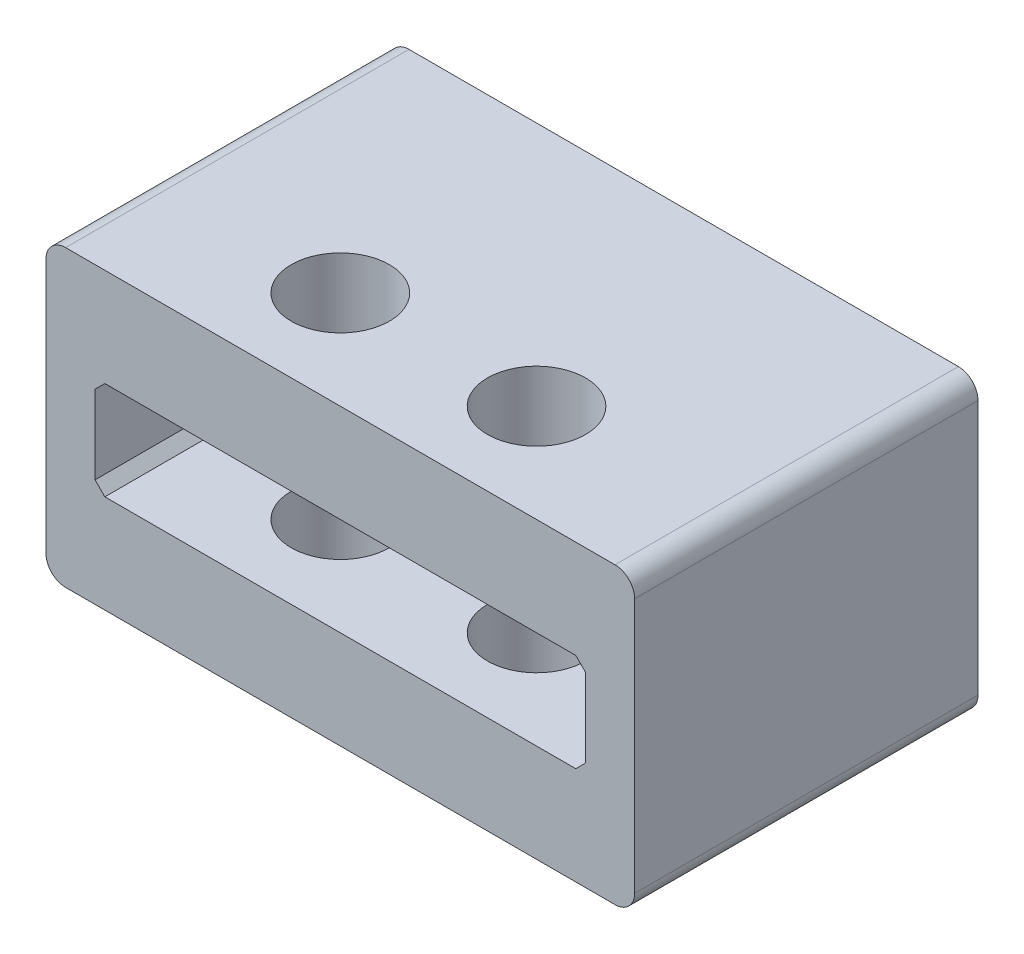
ISO-10303-21;
HEADER;
FILE_DESCRIPTION(('STEP AP214'),'2;1');
FILE_NAME('part.step','',(''),(''),'','','');
FILE_SCHEMA(('AUTOMOTIVE_DESIGN { 1 0 10303 214 1 1 1 1 }'));
ENDSEC;
DATA;
#1=APPLICATION_CONTEXT('core data for automotive mechanical design processes');
#2=APPLICATION_PROTOCOL_DEFINITION('international standard','automotive_design',2000,#1);
#3=PRODUCT_CONTEXT('',#1,'mechanical');
#4=PRODUCT('Part','Part','',(#3));
#5=PRODUCT_RELATED_PRODUCT_CATEGORY('part','',(#4));
#6=PRODUCT_DEFINITION_FORMATION('','',#4);
#7=PRODUCT_DEFINITION_CONTEXT('part definition',#1,'design');
#8=PRODUCT_DEFINITION('design','',#6,#7);
#9=PRODUCT_DEFINITION_SHAPE('','',#8);
#10=(LENGTH_UNIT() NAMED_UNIT(*) SI_UNIT(.MILLI.,.METRE.));
#11=(NAMED_UNIT(*) PLANE_ANGLE_UNIT() SI_UNIT($,.RADIAN.));
#12=(NAMED_UNIT(*) SI_UNIT($,.STERADIAN.) SOLID_ANGLE_UNIT());
#13=UNCERTAINTY_MEASURE_WITH_UNIT(LENGTH_MEASURE(1.E-05),#10,'distance_accuracy_value','');
#14=(GEOMETRIC_REPRESENTATION_CONTEXT(3) GLOBAL_UNCERTAINTY_ASSIGNED_CONTEXT((#13)) GLOBAL_UNIT_ASSIGNED_CONTEXT((#10,
#11,#12)) REPRESENTATION_CONTEXT('',''));
#15=CARTESIAN_POINT('',(0.,0.,0.));
#16=DIRECTION('',(0.,0.,1.));
#17=DIRECTION('',(1.,0.,0.));
#18=AXIS2_PLACEMENT_3D('',#15,#16,#17);
#19=CARTESIAN_POINT('',(0.,0.,45.));
#20=DIRECTION('',(0.,0.,1.));
#21=DIRECTION('',(1.,0.,0.));
#22=AXIS2_PLACEMENT_3D('',#19,#20,#21);
#23=PLANE('',#22);
#24=DIRECTION('',(0.,1.,0.));
#25=VECTOR('',#24,1.);
#26=CARTESIAN_POINT('',(-30.,15.,45.));
#27=LINE('',#26,#25);
#28=CARTESIAN_POINT('',(-30.,-13.,45.));
#29=VERTEX_POINT('',#28);
#30=CARTESIAN_POINT('',(-30.,13.,45.));
#31=VERTEX_POINT('',#30);
#32=EDGE_CURVE('E234',#29,#31,#27,.T.);
#33=ORIENTED_EDGE('',*,*,#32,.F.);
#34=CARTESIAN_POINT('',(-28.,-13.,45.));
#35=DIRECTION('',(0.,0.,1.));
#36=DIRECTION('',(1.,0.,0.));
#37=AXIS2_PLACEMENT_3D('',#34,#35,#36);
#38=CIRCLE('',#37,2.);
#39=CARTESIAN_POINT('',(-28.,-15.,45.));
#40=VERTEX_POINT('',#39);
#41=EDGE_CURVE('E313',#29,#40,#38,.T.);
#42=ORIENTED_EDGE('',*,*,#41,.T.);
#43=DIRECTION('',(-1.,0.,0.));
#44=VECTOR('',#43,1.);
#45=CARTESIAN_POINT('',(-30.,-15.,45.));
#46=LINE('',#45,#44);
#47=CARTESIAN_POINT('',(28.,-15.,45.));
#48=VERTEX_POINT('',#47);
#49=EDGE_CURVE('E225',#48,#40,#46,.T.);
#50=ORIENTED_EDGE('',*,*,#49,.F.);
#51=CARTESIAN_POINT('',(28.,-13.,45.));
#52=DIRECTION('',(0.,0.,1.));
#53=DIRECTION('',(1.,0.,0.));
#54=AXIS2_PLACEMENT_3D('',#51,#52,#53);
#55=CIRCLE('',#54,2.);
#56=CARTESIAN_POINT('',(30.,-13.,45.));
#57=VERTEX_POINT('',#56);
#58=EDGE_CURVE('E304',#48,#57,#55,.T.);
#59=ORIENTED_EDGE('',*,*,#58,.T.);
#60=DIRECTION('',(0.,-1.,0.));
#61=VECTOR('',#60,1.);
#62=CARTESIAN_POINT('',(30.,-15.,45.));
#63=LINE('',#62,#61);
#64=CARTESIAN_POINT('',(30.,13.,45.));
#65=VERTEX_POINT('',#64);
#66=EDGE_CURVE('E248',#65,#57,#63,.T.);
#67=ORIENTED_EDGE('',*,*,#66,.F.);
#68=CARTESIAN_POINT('',(28.,13.,45.));
#69=DIRECTION('',(0.,0.,1.));
#70=DIRECTION('',(1.,0.,0.));
#71=AXIS2_PLACEMENT_3D('',#68,#69,#70);
#72=CIRCLE('',#71,2.);
#73=CARTESIAN_POINT('',(28.,15.,45.));
#74=VERTEX_POINT('',#73);
#75=EDGE_CURVE('E307',#65,#74,#72,.T.);
#76=ORIENTED_EDGE('',*,*,#75,.T.);
#77=DIRECTION('',(1.,0.,0.));
#78=VECTOR('',#77,1.);
#79=CARTESIAN_POINT('',(30.,15.,45.));
#80=LINE('',#79,#78);
#81=CARTESIAN_POINT('',(-28.,15.,45.));
#82=VERTEX_POINT('',#81);
#83=EDGE_CURVE('E242',#82,#74,#80,.T.);
#84=ORIENTED_EDGE('',*,*,#83,.F.);
#85=CARTESIAN_POINT('',(-28.,13.,45.));
#86=DIRECTION('',(0.,0.,1.));
#87=DIRECTION('',(1.,0.,0.));
#88=AXIS2_PLACEMENT_3D('',#85,#86,#87);
#89=CIRCLE('',#88,2.);
#90=EDGE_CURVE('E310',#82,#31,#89,.T.);
#91=ORIENTED_EDGE('',*,*,#90,.T.);
#92=EDGE_LOOP('',(#33,#42,#50,#59,#67,#76,#84,#91));
#93=FACE_BOUND('',#92,.T.);
#94=DIRECTION('',(0.,-1.,0.));
#95=VECTOR('',#94,1.);
#96=CARTESIAN_POINT('',(25.,0.,45.));
#97=LINE('',#96,#95);
#98=CARTESIAN_POINT('',(25.,4.,45.));
#99=VERTEX_POINT('',#98);
#100=CARTESIAN_POINT('',(25.,-4.00000000000002,45.));
#101=VERTEX_POINT('',#100);
#102=EDGE_CURVE('E406',#99,#101,#97,.T.);
#103=ORIENTED_EDGE('',*,*,#102,.T.);
#104=DIRECTION('',(0.70710678118655,0.707106781186545,0.));
#105=VECTOR('',#104,1.);
#106=CARTESIAN_POINT('',(24.,-5.,45.));
#107=LINE('',#106,#105);
#108=CARTESIAN_POINT('',(24.,-5.,45.));
#109=VERTEX_POINT('',#108);
#110=EDGE_CURVE('E294',#101,#109,#107,.F.);
#111=ORIENTED_EDGE('',*,*,#110,.T.);
#112=DIRECTION('',(-1.,0.,0.));
#113=VECTOR('',#112,1.);
#114=CARTESIAN_POINT('',(0.,-5.,45.));
#115=LINE('',#114,#113);
#116=CARTESIAN_POINT('',(-24.,-5.,45.));
#117=VERTEX_POINT('',#116);
#118=EDGE_CURVE('E387',#109,#117,#115,.T.);
#119=ORIENTED_EDGE('',*,*,#118,.T.);
#120=DIRECTION('',(0.707106781186543,-0.707106781186552,0.));
#121=VECTOR('',#120,1.);
#122=CARTESIAN_POINT('',(-25.,-3.99999999999999,45.));
#123=LINE('',#122,#121);
#124=CARTESIAN_POINT('',(-25.,-3.99999999999999,45.));
#125=VERTEX_POINT('',#124);
#126=EDGE_CURVE('E288',#117,#125,#123,.F.);
#127=ORIENTED_EDGE('',*,*,#126,.T.);
#128=DIRECTION('',(0.,1.,0.));
#129=VECTOR('',#128,1.);
#130=CARTESIAN_POINT('',(-25.,0.,45.));
#131=LINE('',#130,#129);
#132=CARTESIAN_POINT('',(-25.,4.00000000000002,45.));
#133=VERTEX_POINT('',#132);
#134=EDGE_CURVE('E401',#125,#133,#131,.T.);
#135=ORIENTED_EDGE('',*,*,#134,.T.);
#136=DIRECTION('',(-0.70710678118655,-0.707106781186545,0.));
#137=VECTOR('',#136,1.);
#138=CARTESIAN_POINT('',(-24.,5.,45.));
#139=LINE('',#138,#137);
#140=CARTESIAN_POINT('',(-24.,5.,45.));
#141=VERTEX_POINT('',#140);
#142=EDGE_CURVE('E285',#133,#141,#139,.F.);
#143=ORIENTED_EDGE('',*,*,#142,.T.);
#144=DIRECTION('',(1.,0.,0.));
#145=VECTOR('',#144,1.);
#146=CARTESIAN_POINT('',(0.,5.,45.));
#147=LINE('',#146,#145);
#148=CARTESIAN_POINT('',(24.,5.,45.));
#149=VERTEX_POINT('',#148);
#150=EDGE_CURVE('E422',#141,#149,#147,.T.);
#151=ORIENTED_EDGE('',*,*,#150,.T.);
#152=DIRECTION('',(-0.707106781186543,0.707106781186552,0.));
#153=VECTOR('',#152,1.);
#154=CARTESIAN_POINT('',(25.,4.,45.));
#155=LINE('',#154,#153);
#156=EDGE_CURVE('E291',#149,#99,#155,.F.);
#157=ORIENTED_EDGE('',*,*,#156,.T.);
#158=EDGE_LOOP('',(#103,#111,#119,#127,#135,#143,#151,#157));
#159=FACE_BOUND('',#158,.T.);
#160=ADVANCED_FACE('F47',(#93,#159),#23,.T.);
#161=CARTESIAN_POINT('',(30.,0.,0.));
#162=DIRECTION('',(1.,0.,0.));
#163=DIRECTION('',(0.,1.,0.));
#164=AXIS2_PLACEMENT_3D('',#161,#162,#163);
#165=PLANE('',#164);
#166=DIRECTION('',(0.,1.,0.));
#167=VECTOR('',#166,1.);
#168=CARTESIAN_POINT('',(30.,0.,10.));
#169=LINE('',#168,#167);
#170=CARTESIAN_POINT('',(30.,-13.,10.));
#171=VERTEX_POINT('',#170);
#172=CARTESIAN_POINT('',(30.,13.,10.));
#173=VERTEX_POINT('',#172);
#174=EDGE_CURVE('E346',#171,#173,#169,.T.);
#175=ORIENTED_EDGE('',*,*,#174,.T.);
#176=DIRECTION('',(0.,0.,1.));
#177=VECTOR('',#176,1.);
#178=CARTESIAN_POINT('',(30.,13.,0.));
#179=LINE('',#178,#177);
#180=EDGE_CURVE('E11',#173,#65,#179,.T.);
#181=ORIENTED_EDGE('',*,*,#180,.T.);
#182=ORIENTED_EDGE('',*,*,#66,.T.);
#183=DIRECTION('',(0.,0.,1.));
#184=VECTOR('',#183,1.);
#185=CARTESIAN_POINT('',(30.,-13.,0.));
#186=LINE('',#185,#184);
#187=EDGE_CURVE('E56',#57,#171,#186,.F.);
#188=ORIENTED_EDGE('',*,*,#187,.T.);
#189=EDGE_LOOP('',(#175,#181,#182,#188));
#190=FACE_BOUND('',#189,.T.);
#191=ADVANCED_FACE('F345',(#190),#165,.T.);
#192=CARTESIAN_POINT('',(0.,0.,25.));
#193=DIRECTION('',(0.,0.,1.));
#194=DIRECTION('',(1.,0.,0.));
#195=AXIS2_PLACEMENT_3D('',#192,#193,#194);
#196=PLANE('',#195);
#197=DIRECTION('',(-1.,0.,0.));
#198=VECTOR('',#197,1.);
#199=CARTESIAN_POINT('',(25.,5.,25.));
#200=LINE('',#199,#198);
#201=CARTESIAN_POINT('',(24.,5.,25.));
#202=VERTEX_POINT('',#201);
#203=CARTESIAN_POINT('',(-24.,5.,25.));
#204=VERTEX_POINT('',#203);
#205=EDGE_CURVE('E391',#202,#204,#200,.T.);
#206=ORIENTED_EDGE('',*,*,#205,.T.);
#207=DIRECTION('',(0.70710678118655,0.707106781186545,0.));
#208=VECTOR('',#207,1.);
#209=CARTESIAN_POINT('',(-14.4999999999999,14.5,25.));
#210=LINE('',#209,#208);
#211=CARTESIAN_POINT('',(-25.,4.00000000000002,25.));
#212=VERTEX_POINT('',#211);
#213=EDGE_CURVE('E261',#204,#212,#210,.F.);
#214=ORIENTED_EDGE('',*,*,#213,.T.);
#215=DIRECTION('',(0.,-1.,0.));
#216=VECTOR('',#215,1.);
#217=CARTESIAN_POINT('',(-25.,5.,25.));
#218=LINE('',#217,#216);
#219=CARTESIAN_POINT('',(-25.,-3.99999999999999,25.));
#220=VERTEX_POINT('',#219);
#221=EDGE_CURVE('E405',#212,#220,#218,.T.);
#222=ORIENTED_EDGE('',*,*,#221,.T.);
#223=DIRECTION('',(-0.707106781186543,0.707106781186552,0.));
#224=VECTOR('',#223,1.);
#225=CARTESIAN_POINT('',(-14.5000000000002,-14.5,25.));
#226=LINE('',#225,#224);
#227=CARTESIAN_POINT('',(-24.,-5.,25.));
#228=VERTEX_POINT('',#227);
#229=EDGE_CURVE('E258',#220,#228,#226,.F.);
#230=ORIENTED_EDGE('',*,*,#229,.T.);
#231=DIRECTION('',(1.,0.,0.));
#232=VECTOR('',#231,1.);
#233=CARTESIAN_POINT('',(-25.,-5.,25.));
#234=LINE('',#233,#232);
#235=CARTESIAN_POINT('',(24.,-4.99999999999999,25.));
#236=VERTEX_POINT('',#235);
#237=EDGE_CURVE('E392',#228,#236,#234,.T.);
#238=ORIENTED_EDGE('',*,*,#237,.T.);
#239=DIRECTION('',(-0.70710678118655,-0.707106781186545,0.));
#240=VECTOR('',#239,1.);
#241=CARTESIAN_POINT('',(14.4999999999999,-14.5,25.));
#242=LINE('',#241,#240);
#243=CARTESIAN_POINT('',(25.,-4.00000000000002,25.));
#244=VERTEX_POINT('',#243);
#245=EDGE_CURVE('E252',#236,#244,#242,.F.);
#246=ORIENTED_EDGE('',*,*,#245,.T.);
#247=DIRECTION('',(0.,1.,0.));
#248=VECTOR('',#247,1.);
#249=CARTESIAN_POINT('',(25.,-5.,25.));
#250=LINE('',#249,#248);
#251=CARTESIAN_POINT('',(25.,4.,25.));
#252=VERTEX_POINT('',#251);
#253=EDGE_CURVE('E410',#244,#252,#250,.T.);
#254=ORIENTED_EDGE('',*,*,#253,.T.);
#255=DIRECTION('',(0.707106781186543,-0.707106781186552,0.));
#256=VECTOR('',#255,1.);
#257=CARTESIAN_POINT('',(14.5000000000002,14.5,25.));
#258=LINE('',#257,#256);
#259=EDGE_CURVE('E255',#252,#202,#258,.F.);
#260=ORIENTED_EDGE('',*,*,#259,.T.);
#261=EDGE_LOOP('',(#206,#214,#222,#230,#238,#246,#254,#260));
#262=FACE_BOUND('',#261,.T.);
#263=CARTESIAN_POINT('',(-15.,0.,25.));
#264=DIRECTION('',(0.,0.,-1.));
#265=DIRECTION('',(0.,1.,0.));
#266=AXIS2_PLACEMENT_3D('',#263,#264,#265);
#267=CIRCLE('',#266,4.);
#268=CARTESIAN_POINT('',(-15.,4.,25.));
#269=VERTEX_POINT('',#268);
#270=EDGE_CURVE('E396',#269,#269,#267,.T.);
#271=ORIENTED_EDGE('',*,*,#270,.T.);
#272=EDGE_LOOP('',(#271));
#273=FACE_BOUND('',#272,.T.);
#274=CARTESIAN_POINT('',(15.,0.,25.));
#275=DIRECTION('',(0.,0.,-1.));
#276=DIRECTION('',(0.,1.,0.));
#277=AXIS2_PLACEMENT_3D('',#274,#275,#276);
#278=CIRCLE('',#277,4.);
#279=CARTESIAN_POINT('',(15.,4.,25.));
#280=VERTEX_POINT('',#279);
#281=EDGE_CURVE('E395',#280,#280,#278,.T.);
#282=ORIENTED_EDGE('',*,*,#281,.T.);
#283=EDGE_LOOP('',(#282));
#284=FACE_BOUND('',#283,.T.);
#285=ADVANCED_FACE('F452',(#262,#273,#284),#196,.T.);
#286=CARTESIAN_POINT('',(-25.,0.,45.));
#287=DIRECTION('',(-1.,0.,0.));
#288=DIRECTION('',(0.,0.,1.));
#289=AXIS2_PLACEMENT_3D('',#286,#287,#288);
#290=PLANE('',#289);
#291=ORIENTED_EDGE('',*,*,#221,.F.);
#292=DIRECTION('',(0.,0.,1.));
#293=VECTOR('',#292,1.);
#294=CARTESIAN_POINT('',(-25.,4.00000000000002,45.));
#295=LINE('',#294,#293);
#296=EDGE_CURVE('E268',#212,#133,#295,.T.);
#297=ORIENTED_EDGE('',*,*,#296,.T.);
#298=ORIENTED_EDGE('',*,*,#134,.F.);
#299=DIRECTION('',(0.,0.,-1.));
#300=VECTOR('',#299,1.);
#301=CARTESIAN_POINT('',(-25.,-3.99999999999999,25.));
#302=LINE('',#301,#300);
#303=EDGE_CURVE('E264',#125,#220,#302,.T.);
#304=ORIENTED_EDGE('',*,*,#303,.T.);
#305=EDGE_LOOP('',(#291,#297,#298,#304));
#306=FACE_BOUND('',#305,.T.);
#307=ADVANCED_FACE('F468',(#306),#290,.F.);
#308=CARTESIAN_POINT('',(25.,0.,45.));
#309=DIRECTION('',(1.,0.,0.));
#310=DIRECTION('',(0.,1.,0.));
#311=AXIS2_PLACEMENT_3D('',#308,#309,#310);
#312=PLANE('',#311);
#313=ORIENTED_EDGE('',*,*,#102,.F.);
#314=DIRECTION('',(0.,0.,-1.));
#315=VECTOR('',#314,1.);
#316=CARTESIAN_POINT('',(25.,4.,25.));
#317=LINE('',#316,#315);
#318=EDGE_CURVE('E281',#99,#252,#317,.T.);
#319=ORIENTED_EDGE('',*,*,#318,.T.);
#320=ORIENTED_EDGE('',*,*,#253,.F.);
#321=DIRECTION('',(0.,0.,1.));
#322=VECTOR('',#321,1.);
#323=CARTESIAN_POINT('',(25.,-4.00000000000002,45.));
#324=LINE('',#323,#322);
#325=EDGE_CURVE('E278',#244,#101,#324,.T.);
#326=ORIENTED_EDGE('',*,*,#325,.T.);
#327=EDGE_LOOP('',(#313,#319,#320,#326));
#328=FACE_BOUND('',#327,.T.);
#329=ADVANCED_FACE('F485',(#328),#312,.F.);
#330=CARTESIAN_POINT('',(0.,5.,45.));
#331=DIRECTION('',(0.,1.,0.));
#332=DIRECTION('',(1.,0.,0.));
#333=AXIS2_PLACEMENT_3D('',#330,#331,#332);
#334=PLANE('',#333);
#335=CARTESIAN_POINT('',(10.,5.,35.));
#336=DIRECTION('',(0.,1.,0.));
#337=DIRECTION('',(1.,0.,0.));
#338=AXIS2_PLACEMENT_3D('',#335,#336,#337);
#339=CIRCLE('',#338,5.);
#340=CARTESIAN_POINT('',(5.,5.,35.));
#341=VERTEX_POINT('',#340);
#342=EDGE_CURVE('E415',#341,#341,#339,.T.);
#343=ORIENTED_EDGE('',*,*,#342,.T.);
#344=EDGE_LOOP('',(#343));
#345=FACE_BOUND('',#344,.T.);
#346=CARTESIAN_POINT('',(-10.,5.,35.));
#347=DIRECTION('',(0.,1.,0.));
#348=DIRECTION('',(1.,0.,0.));
#349=AXIS2_PLACEMENT_3D('',#346,#347,#348);
#350=CIRCLE('',#349,5.);
#351=CARTESIAN_POINT('',(-15.,5.,35.));
#352=VERTEX_POINT('',#351);
#353=EDGE_CURVE('E414',#352,#352,#350,.T.);
#354=ORIENTED_EDGE('',*,*,#353,.T.);
#355=EDGE_LOOP('',(#354));
#356=FACE_BOUND('',#355,.T.);
#357=ORIENTED_EDGE('',*,*,#150,.F.);
#358=DIRECTION('',(0.,0.,-1.));
#359=VECTOR('',#358,1.);
#360=CARTESIAN_POINT('',(-24.,5.,25.));
#361=LINE('',#360,#359);
#362=EDGE_CURVE('E247',#141,#204,#361,.T.);
#363=ORIENTED_EDGE('',*,*,#362,.T.);
#364=ORIENTED_EDGE('',*,*,#205,.F.);
#365=DIRECTION('',(0.,0.,1.));
#366=VECTOR('',#365,1.);
#367=CARTESIAN_POINT('',(24.,5.,45.));
#368=LINE('',#367,#366);
#369=EDGE_CURVE('E244',#202,#149,#368,.T.);
#370=ORIENTED_EDGE('',*,*,#369,.T.);
#371=EDGE_LOOP('',(#357,#363,#364,#370));
#372=FACE_BOUND('',#371,.T.);
#373=ADVANCED_FACE('F476',(#345,#356,#372),#334,.F.);
#374=CARTESIAN_POINT('',(0.,-5.,45.));
#375=DIRECTION('',(0.,-1.,0.));
#376=DIRECTION('',(0.,0.,-1.));
#377=AXIS2_PLACEMENT_3D('',#374,#375,#376);
#378=PLANE('',#377);
#379=CARTESIAN_POINT('',(10.,-5.,35.));
#380=DIRECTION('',(0.,-1.,0.));
#381=DIRECTION('',(1.,0.,0.));
#382=AXIS2_PLACEMENT_3D('',#379,#380,#381);
#383=CIRCLE('',#382,5.);
#384=CARTESIAN_POINT('',(5.,-5.,35.));
#385=VERTEX_POINT('',#384);
#386=EDGE_CURVE('E399',#385,#385,#383,.T.);
#387=ORIENTED_EDGE('',*,*,#386,.T.);
#388=EDGE_LOOP('',(#387));
#389=FACE_BOUND('',#388,.T.);
#390=CARTESIAN_POINT('',(-10.,-5.,35.));
#391=DIRECTION('',(0.,-1.,0.));
#392=DIRECTION('',(1.,0.,0.));
#393=AXIS2_PLACEMENT_3D('',#390,#391,#392);
#394=CIRCLE('',#393,5.);
#395=CARTESIAN_POINT('',(-15.,-5.,35.));
#396=VERTEX_POINT('',#395);
#397=EDGE_CURVE('E411',#396,#396,#394,.T.);
#398=ORIENTED_EDGE('',*,*,#397,.T.);
#399=EDGE_LOOP('',(#398));
#400=FACE_BOUND('',#399,.T.);
#401=ORIENTED_EDGE('',*,*,#237,.F.);
#402=DIRECTION('',(0.,0.,1.));
#403=VECTOR('',#402,1.);
#404=CARTESIAN_POINT('',(-24.,-5.,45.));
#405=LINE('',#404,#403);
#406=EDGE_CURVE('E275',#228,#117,#405,.T.);
#407=ORIENTED_EDGE('',*,*,#406,.T.);
#408=ORIENTED_EDGE('',*,*,#118,.F.);
#409=DIRECTION('',(0.,0.,-1.));
#410=VECTOR('',#409,1.);
#411=CARTESIAN_POINT('',(24.,-5.,25.));
#412=LINE('',#411,#410);
#413=EDGE_CURVE('E271',#109,#236,#412,.T.);
#414=ORIENTED_EDGE('',*,*,#413,.T.);
#415=EDGE_LOOP('',(#401,#407,#408,#414));
#416=FACE_BOUND('',#415,.T.);
#417=ADVANCED_FACE('F457',(#389,#400,#416),#378,.F.);
#418=CARTESIAN_POINT('',(-10.,-65.7774721070176,35.));
#419=DIRECTION('',(0.,1.,0.));
#420=DIRECTION('',(1.,0.,0.));
#421=AXIS2_PLACEMENT_3D('',#418,#419,#420);
#422=CYLINDRICAL_SURFACE('',#421,5.);
#423=ORIENTED_EDGE('',*,*,#353,.F.);
#424=EDGE_LOOP('',(#423));
#425=FACE_BOUND('',#424,.T.);
#426=CARTESIAN_POINT('',(-10.,15.,35.));
#427=DIRECTION('',(0.,-1.,0.));
#428=DIRECTION('',(1.,0.,0.));
#429=AXIS2_PLACEMENT_3D('',#426,#427,#428);
#430=CIRCLE('',#429,5.);
#431=CARTESIAN_POINT('',(-15.,15.,35.));
#432=VERTEX_POINT('',#431);
#433=EDGE_CURVE('E239',#432,#432,#430,.T.);
#434=ORIENTED_EDGE('',*,*,#433,.F.);
#435=EDGE_LOOP('',(#434));
#436=FACE_BOUND('',#435,.T.);
#437=ADVANCED_FACE('F509',(#425,#436),#422,.F.);
#438=CARTESIAN_POINT('',(-10.,-65.7774721070176,35.));
#439=DIRECTION('',(0.,1.,0.));
#440=DIRECTION('',(1.,0.,0.));
#441=AXIS2_PLACEMENT_3D('',#438,#439,#440);
#442=CYLINDRICAL_SURFACE('',#441,5.);
#443=ORIENTED_EDGE('',*,*,#397,.F.);
#444=EDGE_LOOP('',(#443));
#445=FACE_BOUND('',#444,.T.);
#446=CARTESIAN_POINT('',(-10.,-15.,35.));
#447=DIRECTION('',(0.,1.,0.));
#448=DIRECTION('',(1.,0.,0.));
#449=AXIS2_PLACEMENT_3D('',#446,#447,#448);
#450=CIRCLE('',#449,5.);
#451=CARTESIAN_POINT('',(-15.,-15.,35.));
#452=VERTEX_POINT('',#451);
#453=EDGE_CURVE('E220',#452,#452,#450,.T.);
#454=ORIENTED_EDGE('',*,*,#453,.F.);
#455=EDGE_LOOP('',(#454));
#456=FACE_BOUND('',#455,.T.);
#457=ADVANCED_FACE('F512',(#445,#456),#442,.F.);
#458=CARTESIAN_POINT('',(10.,-65.7774721070176,35.));
#459=DIRECTION('',(0.,1.,0.));
#460=DIRECTION('',(1.,0.,0.));
#461=AXIS2_PLACEMENT_3D('',#458,#459,#460);
#462=CYLINDRICAL_SURFACE('',#461,5.);
#463=ORIENTED_EDGE('',*,*,#342,.F.);
#464=EDGE_LOOP('',(#463));
#465=FACE_BOUND('',#464,.T.);
#466=CARTESIAN_POINT('',(10.,15.,35.));
#467=DIRECTION('',(0.,-1.,0.));
#468=DIRECTION('',(1.,0.,0.));
#469=AXIS2_PLACEMENT_3D('',#466,#467,#468);
#470=CIRCLE('',#469,5.);
#471=CARTESIAN_POINT('',(5.,15.,35.));
#472=VERTEX_POINT('',#471);
#473=EDGE_CURVE('E243',#472,#472,#470,.T.);
#474=ORIENTED_EDGE('',*,*,#473,.F.);
#475=EDGE_LOOP('',(#474));
#476=FACE_BOUND('',#475,.T.);
#477=ADVANCED_FACE('F514',(#465,#476),#462,.F.);
#478=CARTESIAN_POINT('',(10.,-65.7774721070176,35.));
#479=DIRECTION('',(0.,1.,0.));
#480=DIRECTION('',(1.,0.,0.));
#481=AXIS2_PLACEMENT_3D('',#478,#479,#480);
#482=CYLINDRICAL_SURFACE('',#481,5.);
#483=ORIENTED_EDGE('',*,*,#386,.F.);
#484=EDGE_LOOP('',(#483));
#485=FACE_BOUND('',#484,.T.);
#486=CARTESIAN_POINT('',(10.,-15.,35.));
#487=DIRECTION('',(0.,1.,0.));
#488=DIRECTION('',(1.,0.,0.));
#489=AXIS2_PLACEMENT_3D('',#486,#487,#488);
#490=CIRCLE('',#489,5.);
#491=CARTESIAN_POINT('',(5.,-15.,35.));
#492=VERTEX_POINT('',#491);
#493=EDGE_CURVE('E226',#492,#492,#490,.T.);
#494=ORIENTED_EDGE('',*,*,#493,.F.);
#495=EDGE_LOOP('',(#494));
#496=FACE_BOUND('',#495,.T.);
#497=ADVANCED_FACE('F517',(#485,#496),#482,.F.);
#498=CARTESIAN_POINT('',(-15.,0.,25.));
#499=DIRECTION('',(0.,0.,1.));
#500=DIRECTION('',(0.,1.,0.));
#501=AXIS2_PLACEMENT_3D('',#498,#499,#500);
#502=CONICAL_SURFACE('',#501,4.,0.78539816339745);
#503=ORIENTED_EDGE('',*,*,#270,.F.);
#504=EDGE_LOOP('',(#503));
#505=FACE_BOUND('',#504,.T.);
#506=CARTESIAN_POINT('',(-15.,0.,23.5));
#507=DIRECTION('',(0.,0.,1.));
#508=DIRECTION('',(0.,1.,0.));
#509=AXIS2_PLACEMENT_3D('',#506,#507,#508);
#510=CIRCLE('',#509,2.5);
#511=CARTESIAN_POINT('',(-15.,2.5,23.5));
#512=VERTEX_POINT('',#511);
#513=EDGE_CURVE('E400',#512,#512,#510,.T.);
#514=ORIENTED_EDGE('',*,*,#513,.F.);
#515=EDGE_LOOP('',(#514));
#516=FACE_BOUND('',#515,.T.);
#517=ADVANCED_FACE('F507',(#505,#516),#502,.F.);
#518=CARTESIAN_POINT('',(-15.,0.,25.));
#519=DIRECTION('',(0.,0.,-1.));
#520=DIRECTION('',(0.,1.,0.));
#521=AXIS2_PLACEMENT_3D('',#518,#519,#520);
#522=CYLINDRICAL_SURFACE('',#521,2.5);
#523=ORIENTED_EDGE('',*,*,#513,.T.);
#524=EDGE_LOOP('',(#523));
#525=FACE_BOUND('',#524,.T.);
#526=CARTESIAN_POINT('',(-15.,0.,10.));
#527=DIRECTION('',(0.,0.,-1.));
#528=DIRECTION('',(0.,1.,0.));
#529=AXIS2_PLACEMENT_3D('',#526,#527,#528);
#530=CIRCLE('',#529,2.5);
#531=CARTESIAN_POINT('',(-15.,-2.5,10.));
#532=VERTEX_POINT('',#531);
#533=EDGE_CURVE('E386',#532,#532,#530,.T.);
#534=ORIENTED_EDGE('',*,*,#533,.T.);
#535=EDGE_LOOP('',(#534));
#536=FACE_BOUND('',#535,.T.);
#537=ADVANCED_FACE('F666',(#525,#536),#522,.F.);
#538=CARTESIAN_POINT('',(15.,0.,25.));
#539=DIRECTION('',(0.,0.,1.));
#540=DIRECTION('',(0.,1.,0.));
#541=AXIS2_PLACEMENT_3D('',#538,#539,#540);
#542=CONICAL_SURFACE('',#541,4.,0.78539816339745);
#543=ORIENTED_EDGE('',*,*,#281,.F.);
#544=EDGE_LOOP('',(#543));
#545=FACE_BOUND('',#544,.T.);
#546=CARTESIAN_POINT('',(15.,0.,23.5));
#547=DIRECTION('',(0.,0.,1.));
#548=DIRECTION('',(0.,1.,0.));
#549=AXIS2_PLACEMENT_3D('',#546,#547,#548);
#550=CIRCLE('',#549,2.5);
#551=CARTESIAN_POINT('',(15.,2.5,23.5));
#552=VERTEX_POINT('',#551);
#553=EDGE_CURVE('E232',#552,#552,#550,.T.);
#554=ORIENTED_EDGE('',*,*,#553,.F.);
#555=EDGE_LOOP('',(#554));
#556=FACE_BOUND('',#555,.T.);
#557=ADVANCED_FACE('F529',(#545,#556),#542,.F.);
#558=CARTESIAN_POINT('',(15.,0.,25.));
#559=DIRECTION('',(0.,0.,-1.));
#560=DIRECTION('',(0.,1.,0.));
#561=AXIS2_PLACEMENT_3D('',#558,#559,#560);
#562=CYLINDRICAL_SURFACE('',#561,2.5);
#563=ORIENTED_EDGE('',*,*,#553,.T.);
#564=EDGE_LOOP('',(#563));
#565=FACE_BOUND('',#564,.T.);
#566=CARTESIAN_POINT('',(15.,0.,10.));
#567=DIRECTION('',(0.,0.,-1.));
#568=DIRECTION('',(0.,1.,0.));
#569=AXIS2_PLACEMENT_3D('',#566,#567,#568);
#570=CIRCLE('',#569,2.5);
#571=CARTESIAN_POINT('',(15.,-2.5,10.));
#572=VERTEX_POINT('',#571);
#573=EDGE_CURVE('E380',#572,#572,#570,.T.);
#574=ORIENTED_EDGE('',*,*,#573,.T.);
#575=EDGE_LOOP('',(#574));
#576=FACE_BOUND('',#575,.T.);
#577=ADVANCED_FACE('F526',(#565,#576),#562,.F.);
#578=CARTESIAN_POINT('',(0.,-15.,0.));
#579=DIRECTION('',(0.,-1.,0.));
#580=DIRECTION('',(0.,0.,-1.));
#581=AXIS2_PLACEMENT_3D('',#578,#579,#580);
#582=PLANE('',#581);
#583=ORIENTED_EDGE('',*,*,#49,.T.);
#584=DIRECTION('',(0.,0.,1.));
#585=VECTOR('',#584,1.);
#586=CARTESIAN_POINT('',(-28.,-15.,0.));
#587=LINE('',#586,#585);
#588=CARTESIAN_POINT('',(-28.,-15.,10.));
#589=VERTEX_POINT('',#588);
#590=EDGE_CURVE('E320',#40,#589,#587,.F.);
#591=ORIENTED_EDGE('',*,*,#590,.T.);
#592=DIRECTION('',(1.,0.,0.));
#593=VECTOR('',#592,1.);
#594=CARTESIAN_POINT('',(-25.3887360535088,-15.,10.));
#595=LINE('',#594,#593);
#596=CARTESIAN_POINT('',(28.,-15.,10.));
#597=VERTEX_POINT('',#596);
#598=EDGE_CURVE('E356',#589,#597,#595,.T.);
#599=ORIENTED_EDGE('',*,*,#598,.T.);
#600=DIRECTION('',(0.,0.,1.));
#601=VECTOR('',#600,1.);
#602=CARTESIAN_POINT('',(28.,-15.,0.));
#603=LINE('',#602,#601);
#604=EDGE_CURVE('E316',#597,#48,#603,.T.);
#605=ORIENTED_EDGE('',*,*,#604,.T.);
#606=EDGE_LOOP('',(#583,#591,#599,#605));
#607=FACE_BOUND('',#606,.T.);
#608=ORIENTED_EDGE('',*,*,#453,.T.);
#609=EDGE_LOOP('',(#608));
#610=FACE_BOUND('',#609,.T.);
#611=ORIENTED_EDGE('',*,*,#493,.T.);
#612=EDGE_LOOP('',(#611));
#613=FACE_BOUND('',#612,.T.);
#614=ADVANCED_FACE('F221',(#607,#610,#613),#582,.T.);
#615=CARTESIAN_POINT('',(-30.,0.,0.));
#616=DIRECTION('',(-1.,0.,0.));
#617=DIRECTION('',(0.,0.,1.));
#618=AXIS2_PLACEMENT_3D('',#615,#616,#617);
#619=PLANE('',#618);
#620=DIRECTION('',(0.,-1.,0.));
#621=VECTOR('',#620,1.);
#622=CARTESIAN_POINT('',(-30.,0.,10.));
#623=LINE('',#622,#621);
#624=CARTESIAN_POINT('',(-30.,13.,10.));
#625=VERTEX_POINT('',#624);
#626=CARTESIAN_POINT('',(-30.,-13.,10.));
#627=VERTEX_POINT('',#626);
#628=EDGE_CURVE('E374',#625,#627,#623,.T.);
#629=ORIENTED_EDGE('',*,*,#628,.T.);
#630=DIRECTION('',(0.,0.,1.));
#631=VECTOR('',#630,1.);
#632=CARTESIAN_POINT('',(-30.,-13.,0.));
#633=LINE('',#632,#631);
#634=EDGE_CURVE('E300',#627,#29,#633,.T.);
#635=ORIENTED_EDGE('',*,*,#634,.T.);
#636=ORIENTED_EDGE('',*,*,#32,.T.);
#637=DIRECTION('',(0.,0.,1.));
#638=VECTOR('',#637,1.);
#639=CARTESIAN_POINT('',(-30.,13.,0.));
#640=LINE('',#639,#638);
#641=EDGE_CURVE('E297',#31,#625,#640,.F.);
#642=ORIENTED_EDGE('',*,*,#641,.T.);
#643=EDGE_LOOP('',(#629,#635,#636,#642));
#644=FACE_BOUND('',#643,.T.);
#645=ADVANCED_FACE('F372',(#644),#619,.T.);
#646=CARTESIAN_POINT('',(0.,15.,0.));
#647=DIRECTION('',(0.,1.,0.));
#648=DIRECTION('',(1.,0.,0.));
#649=AXIS2_PLACEMENT_3D('',#646,#647,#648);
#650=PLANE('',#649);
#651=DIRECTION('',(-1.,0.,0.));
#652=VECTOR('',#651,1.);
#653=CARTESIAN_POINT('',(-25.3887360535088,15.,10.));
#654=LINE('',#653,#652);
#655=CARTESIAN_POINT('',(28.,15.,10.));
#656=VERTEX_POINT('',#655);
#657=CARTESIAN_POINT('',(-28.,15.,10.));
#658=VERTEX_POINT('',#657);
#659=EDGE_CURVE('E376',#656,#658,#654,.T.);
#660=ORIENTED_EDGE('',*,*,#659,.T.);
#661=DIRECTION('',(0.,0.,1.));
#662=VECTOR('',#661,1.);
#663=CARTESIAN_POINT('',(-28.,15.,0.));
#664=LINE('',#663,#662);
#665=EDGE_CURVE('E336',#658,#82,#664,.T.);
#666=ORIENTED_EDGE('',*,*,#665,.T.);
#667=ORIENTED_EDGE('',*,*,#83,.T.);
#668=DIRECTION('',(0.,0.,1.));
#669=VECTOR('',#668,1.);
#670=CARTESIAN_POINT('',(28.,15.,0.));
#671=LINE('',#670,#669);
#672=EDGE_CURVE('E70',#74,#656,#671,.F.);
#673=ORIENTED_EDGE('',*,*,#672,.T.);
#674=EDGE_LOOP('',(#660,#666,#667,#673));
#675=FACE_BOUND('',#674,.T.);
#676=ORIENTED_EDGE('',*,*,#433,.T.);
#677=EDGE_LOOP('',(#676));
#678=FACE_BOUND('',#677,.T.);
#679=ORIENTED_EDGE('',*,*,#473,.T.);
#680=EDGE_LOOP('',(#679));
#681=FACE_BOUND('',#680,.T.);
#682=ADVANCED_FACE('F602',(#675,#678,#681),#650,.T.);
#683=CARTESIAN_POINT('',(-50.7774721070176,0.,10.));
#684=DIRECTION('',(0.,0.,1.));
#685=DIRECTION('',(1.,0.,0.));
#686=AXIS2_PLACEMENT_3D('',#683,#684,#685);
#687=PLANE('',#686);
#688=ORIENTED_EDGE('',*,*,#533,.F.);
#689=EDGE_LOOP('',(#688));
#690=FACE_BOUND('',#689,.T.);
#691=ORIENTED_EDGE('',*,*,#573,.F.);
#692=EDGE_LOOP('',(#691));
#693=FACE_BOUND('',#692,.T.);
#694=ORIENTED_EDGE('',*,*,#598,.F.);
#695=CARTESIAN_POINT('',(-28.,-13.,10.));
#696=DIRECTION('',(0.,0.,1.));
#697=DIRECTION('',(1.,0.,0.));
#698=AXIS2_PLACEMENT_3D('',#695,#696,#697);
#699=CIRCLE('',#698,2.);
#700=EDGE_CURVE('E331',#589,#627,#699,.F.);
#701=ORIENTED_EDGE('',*,*,#700,.T.);
#702=ORIENTED_EDGE('',*,*,#628,.F.);
#703=CARTESIAN_POINT('',(-28.,13.,10.));
#704=DIRECTION('',(0.,0.,1.));
#705=DIRECTION('',(1.,0.,0.));
#706=AXIS2_PLACEMENT_3D('',#703,#704,#705);
#707=CIRCLE('',#706,2.);
#708=EDGE_CURVE('E63',#625,#658,#707,.F.);
#709=ORIENTED_EDGE('',*,*,#708,.T.);
#710=ORIENTED_EDGE('',*,*,#659,.F.);
#711=CARTESIAN_POINT('',(28.,13.,10.));
#712=DIRECTION('',(0.,0.,1.));
#713=DIRECTION('',(1.,0.,0.));
#714=AXIS2_PLACEMENT_3D('',#711,#712,#713);
#715=CIRCLE('',#714,2.);
#716=EDGE_CURVE('E326',#656,#173,#715,.F.);
#717=ORIENTED_EDGE('',*,*,#716,.T.);
#718=ORIENTED_EDGE('',*,*,#174,.F.);
#719=CARTESIAN_POINT('',(28.,-13.,10.));
#720=DIRECTION('',(0.,0.,1.));
#721=DIRECTION('',(1.,0.,0.));
#722=AXIS2_PLACEMENT_3D('',#719,#720,#721);
#723=CIRCLE('',#722,2.);
#724=EDGE_CURVE('E323',#171,#597,#723,.F.);
#725=ORIENTED_EDGE('',*,*,#724,.T.);
#726=EDGE_LOOP('',(#694,#701,#702,#709,#710,#717,#718,#725));
#727=FACE_BOUND('',#726,.T.);
#728=ADVANCED_FACE('F352',(#690,#693,#727),#687,.F.);
#729=CARTESIAN_POINT('',(-24.,5.,45.));
#730=DIRECTION('',(0.707106781186545,-0.70710678118655,0.));
#731=DIRECTION('',(0.,0.,1.));
#732=AXIS2_PLACEMENT_3D('',#729,#730,#731);
#733=PLANE('',#732);
#734=ORIENTED_EDGE('',*,*,#142,.F.);
#735=ORIENTED_EDGE('',*,*,#296,.F.);
#736=ORIENTED_EDGE('',*,*,#213,.F.);
#737=ORIENTED_EDGE('',*,*,#362,.F.);
#738=EDGE_LOOP('',(#734,#735,#736,#737));
#739=FACE_BOUND('',#738,.T.);
#740=ADVANCED_FACE('F471',(#739),#733,.T.);
#741=CARTESIAN_POINT('',(-25.,-3.99999999999999,45.));
#742=DIRECTION('',(0.707106781186552,0.707106781186542,0.));
#743=DIRECTION('',(0.,0.,1.));
#744=AXIS2_PLACEMENT_3D('',#741,#742,#743);
#745=PLANE('',#744);
#746=ORIENTED_EDGE('',*,*,#126,.F.);
#747=ORIENTED_EDGE('',*,*,#406,.F.);
#748=ORIENTED_EDGE('',*,*,#229,.F.);
#749=ORIENTED_EDGE('',*,*,#303,.F.);
#750=EDGE_LOOP('',(#746,#747,#748,#749));
#751=FACE_BOUND('',#750,.T.);
#752=ADVANCED_FACE('F462',(#751),#745,.T.);
#753=CARTESIAN_POINT('',(25.,4.,45.));
#754=DIRECTION('',(-0.707106781186552,-0.707106781186543,0.));
#755=DIRECTION('',(0.,0.,1.));
#756=AXIS2_PLACEMENT_3D('',#753,#754,#755);
#757=PLANE('',#756);
#758=ORIENTED_EDGE('',*,*,#156,.F.);
#759=ORIENTED_EDGE('',*,*,#369,.F.);
#760=ORIENTED_EDGE('',*,*,#259,.F.);
#761=ORIENTED_EDGE('',*,*,#318,.F.);
#762=EDGE_LOOP('',(#758,#759,#760,#761));
#763=FACE_BOUND('',#762,.T.);
#764=ADVANCED_FACE('F480',(#763),#757,.T.);
#765=CARTESIAN_POINT('',(24.,-5.,45.));
#766=DIRECTION('',(-0.707106781186545,0.70710678118655,0.));
#767=DIRECTION('',(0.,0.,1.));
#768=AXIS2_PLACEMENT_3D('',#765,#766,#767);
#769=PLANE('',#768);
#770=ORIENTED_EDGE('',*,*,#110,.F.);
#771=ORIENTED_EDGE('',*,*,#325,.F.);
#772=ORIENTED_EDGE('',*,*,#245,.F.);
#773=ORIENTED_EDGE('',*,*,#413,.F.);
#774=EDGE_LOOP('',(#770,#771,#772,#773));
#775=FACE_BOUND('',#774,.T.);
#776=ADVANCED_FACE('F488',(#775),#769,.T.);
#777=CARTESIAN_POINT('',(-28.,-13.,0.));
#778=DIRECTION('',(0.,0.,1.));
#779=DIRECTION('',(1.,0.,0.));
#780=AXIS2_PLACEMENT_3D('',#777,#778,#779);
#781=CYLINDRICAL_SURFACE('',#780,2.);
#782=ORIENTED_EDGE('',*,*,#700,.F.);
#783=ORIENTED_EDGE('',*,*,#590,.F.);
#784=ORIENTED_EDGE('',*,*,#41,.F.);
#785=ORIENTED_EDGE('',*,*,#634,.F.);
#786=EDGE_LOOP('',(#782,#783,#784,#785));
#787=FACE_BOUND('',#786,.T.);
#788=ADVANCED_FACE('F369',(#787),#781,.T.);
#789=CARTESIAN_POINT('',(-28.,13.,0.));
#790=DIRECTION('',(0.,0.,1.));
#791=DIRECTION('',(1.,0.,0.));
#792=AXIS2_PLACEMENT_3D('',#789,#790,#791);
#793=CYLINDRICAL_SURFACE('',#792,2.);
#794=ORIENTED_EDGE('',*,*,#708,.F.);
#795=ORIENTED_EDGE('',*,*,#641,.F.);
#796=ORIENTED_EDGE('',*,*,#90,.F.);
#797=ORIENTED_EDGE('',*,*,#665,.F.);
#798=EDGE_LOOP('',(#794,#795,#796,#797));
#799=FACE_BOUND('',#798,.T.);
#800=ADVANCED_FACE('F495',(#799),#793,.T.);
#801=CARTESIAN_POINT('',(28.,13.,0.));
#802=DIRECTION('',(0.,0.,1.));
#803=DIRECTION('',(1.,0.,0.));
#804=AXIS2_PLACEMENT_3D('',#801,#802,#803);
#805=CYLINDRICAL_SURFACE('',#804,2.);
#806=ORIENTED_EDGE('',*,*,#716,.F.);
#807=ORIENTED_EDGE('',*,*,#672,.F.);
#808=ORIENTED_EDGE('',*,*,#75,.F.);
#809=ORIENTED_EDGE('',*,*,#180,.F.);
#810=EDGE_LOOP('',(#806,#807,#808,#809));
#811=FACE_BOUND('',#810,.T.);
#812=ADVANCED_FACE('F635',(#811),#805,.T.);
#813=CARTESIAN_POINT('',(28.,-13.,0.));
#814=DIRECTION('',(0.,0.,1.));
#815=DIRECTION('',(1.,0.,0.));
#816=AXIS2_PLACEMENT_3D('',#813,#814,#815);
#817=CYLINDRICAL_SURFACE('',#816,2.);
#818=ORIENTED_EDGE('',*,*,#724,.F.);
#819=ORIENTED_EDGE('',*,*,#187,.F.);
#820=ORIENTED_EDGE('',*,*,#58,.F.);
#821=ORIENTED_EDGE('',*,*,#604,.F.);
#822=EDGE_LOOP('',(#818,#819,#820,#821));
#823=FACE_BOUND('',#822,.T.);
#824=ADVANCED_FACE('F49',(#823),#817,.T.);
#825=CLOSED_SHELL('',(#160,#191,#285,#307,#329,#373,#417,#437,#457,#477,#497,#517,#537,#557,
#577,#614,#645,#682,#728,#740,#752,#764,#776,#788,#800,#812,#824));
#826=MANIFOLD_SOLID_BREP('B2',#825);
#827=ADVANCED_BREP_SHAPE_REPRESENTATION('',(#18,#826),#14);
#828=SHAPE_DEFINITION_REPRESENTATION(#9,#827);
ENDSEC;
END-ISO-10303-21;
